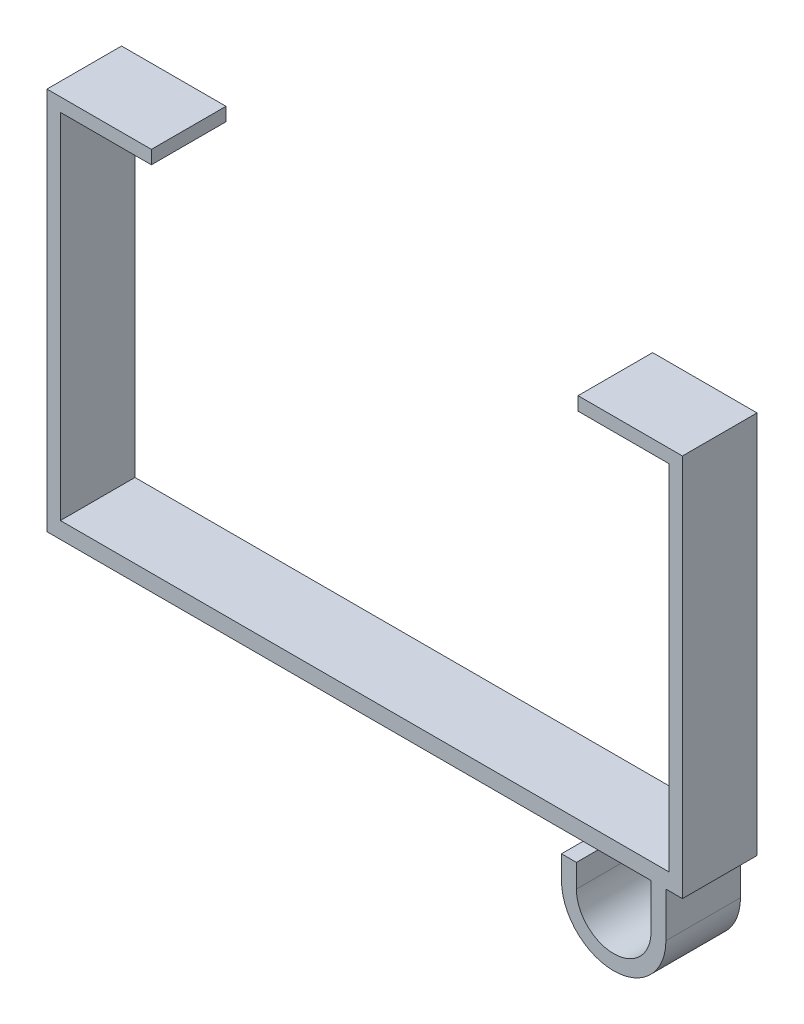
ISO-10303-21;
HEADER;
FILE_DESCRIPTION(('STEP AP214'),'2;1');
FILE_NAME('part.step','',(''),(''),'','','');
FILE_SCHEMA(('AUTOMOTIVE_DESIGN { 1 0 10303 214 1 1 1 1 }'));
ENDSEC;
DATA;
#1=APPLICATION_CONTEXT('core data for automotive mechanical design processes');
#2=APPLICATION_PROTOCOL_DEFINITION('international standard','automotive_design',2000,#1);
#3=PRODUCT_CONTEXT('',#1,'mechanical');
#4=PRODUCT('Part','Part','',(#3));
#5=PRODUCT_RELATED_PRODUCT_CATEGORY('part','',(#4));
#6=PRODUCT_DEFINITION_FORMATION('','',#4);
#7=PRODUCT_DEFINITION_CONTEXT('part definition',#1,'design');
#8=PRODUCT_DEFINITION('design','',#6,#7);
#9=PRODUCT_DEFINITION_SHAPE('','',#8);
#10=(LENGTH_UNIT() NAMED_UNIT(*) SI_UNIT(.MILLI.,.METRE.));
#11=(NAMED_UNIT(*) PLANE_ANGLE_UNIT() SI_UNIT($,.RADIAN.));
#12=(NAMED_UNIT(*) SI_UNIT($,.STERADIAN.) SOLID_ANGLE_UNIT());
#13=UNCERTAINTY_MEASURE_WITH_UNIT(LENGTH_MEASURE(1.E-05),#10,'distance_accuracy_value','');
#14=(GEOMETRIC_REPRESENTATION_CONTEXT(3) GLOBAL_UNCERTAINTY_ASSIGNED_CONTEXT((#13)) GLOBAL_UNIT_ASSIGNED_CONTEXT((#10,
#11,#12)) REPRESENTATION_CONTEXT('',''));
#15=CARTESIAN_POINT('',(0.,0.,0.));
#16=DIRECTION('',(0.,0.,1.));
#17=DIRECTION('',(1.,0.,0.));
#18=AXIS2_PLACEMENT_3D('',#15,#16,#17);
#19=CARTESIAN_POINT('',(0.,-12.85,5.));
#20=DIRECTION('',(0.,1.,0.));
#21=DIRECTION('',(0.,0.,1.));
#22=AXIS2_PLACEMENT_3D('',#19,#20,#21);
#23=PLANE('',#22);
#24=DIRECTION('',(0.,0.,-1.));
#25=VECTOR('',#24,1.);
#26=CARTESIAN_POINT('',(19.1906898394802,-12.85,5.));
#27=LINE('',#26,#25);
#28=CARTESIAN_POINT('',(19.1906898394802,-12.85,5.));
#29=VERTEX_POINT('',#28);
#30=CARTESIAN_POINT('',(19.1906898394802,-12.85,0.));
#31=VERTEX_POINT('',#30);
#32=EDGE_CURVE('E310',#29,#31,#27,.T.);
#33=ORIENTED_EDGE('',*,*,#32,.F.);
#34=DIRECTION('',(1.,0.,0.));
#35=VECTOR('',#34,1.);
#36=CARTESIAN_POINT('',(0.,-12.85,5.));
#37=LINE('',#36,#35);
#38=CARTESIAN_POINT('',(-21.3,-12.85,5.));
#39=VERTEX_POINT('',#38);
#40=EDGE_CURVE('E163',#39,#29,#37,.T.);
#41=ORIENTED_EDGE('',*,*,#40,.F.);
#42=DIRECTION('',(0.,0.,-1.));
#43=VECTOR('',#42,1.);
#44=CARTESIAN_POINT('',(-21.3,-12.85,5.));
#45=LINE('',#44,#43);
#46=CARTESIAN_POINT('',(-21.3,-12.85,0.));
#47=VERTEX_POINT('',#46);
#48=EDGE_CURVE('E175',#39,#47,#45,.T.);
#49=ORIENTED_EDGE('',*,*,#48,.T.);
#50=DIRECTION('',(1.,0.,0.));
#51=VECTOR('',#50,1.);
#52=CARTESIAN_POINT('',(0.,-12.85,0.));
#53=LINE('',#52,#51);
#54=EDGE_CURVE('E221',#47,#31,#53,.T.);
#55=ORIENTED_EDGE('',*,*,#54,.T.);
#56=EDGE_LOOP('',(#33,#41,#49,#55));
#57=FACE_BOUND('',#56,.T.);
#58=ADVANCED_FACE('F43',(#57),#23,.F.);
#59=CARTESIAN_POINT('',(14.3,0.,5.));
#60=DIRECTION('',(1.,0.,0.));
#61=DIRECTION('',(0.,0.,-1.));
#62=AXIS2_PLACEMENT_3D('',#59,#60,#61);
#63=PLANE('',#62);
#64=DIRECTION('',(0.,-1.,0.));
#65=VECTOR('',#64,1.);
#66=CARTESIAN_POINT('',(14.3,0.,0.));
#67=LINE('',#66,#65);
#68=CARTESIAN_POINT('',(14.3,12.85,0.));
#69=VERTEX_POINT('',#68);
#70=CARTESIAN_POINT('',(14.3,11.95,0.));
#71=VERTEX_POINT('',#70);
#72=EDGE_CURVE('E188',#69,#71,#67,.T.);
#73=ORIENTED_EDGE('',*,*,#72,.T.);
#74=DIRECTION('',(0.,0.,-1.));
#75=VECTOR('',#74,1.);
#76=CARTESIAN_POINT('',(14.3,11.95,5.));
#77=LINE('',#76,#75);
#78=CARTESIAN_POINT('',(14.3,11.95,5.));
#79=VERTEX_POINT('',#78);
#80=EDGE_CURVE('E11',#79,#71,#77,.T.);
#81=ORIENTED_EDGE('',*,*,#80,.F.);
#82=DIRECTION('',(0.,-1.,0.));
#83=VECTOR('',#82,1.);
#84=CARTESIAN_POINT('',(14.3,0.,5.));
#85=LINE('',#84,#83);
#86=CARTESIAN_POINT('',(14.3,12.85,5.));
#87=VERTEX_POINT('',#86);
#88=EDGE_CURVE('E232',#87,#79,#85,.T.);
#89=ORIENTED_EDGE('',*,*,#88,.F.);
#90=DIRECTION('',(0.,0.,-1.));
#91=VECTOR('',#90,1.);
#92=CARTESIAN_POINT('',(14.3,12.85,5.));
#93=LINE('',#92,#91);
#94=EDGE_CURVE('E68',#87,#69,#93,.T.);
#95=ORIENTED_EDGE('',*,*,#94,.T.);
#96=EDGE_LOOP('',(#73,#81,#89,#95));
#97=FACE_BOUND('',#96,.T.);
#98=ADVANCED_FACE('F45',(#97),#63,.F.);
#99=CARTESIAN_POINT('',(0.,11.95,5.));
#100=DIRECTION('',(0.,1.,0.));
#101=DIRECTION('',(-1.,0.,0.));
#102=AXIS2_PLACEMENT_3D('',#99,#100,#101);
#103=PLANE('',#102);
#104=DIRECTION('',(1.,0.,0.));
#105=VECTOR('',#104,1.);
#106=CARTESIAN_POINT('',(0.,11.95,0.));
#107=LINE('',#106,#105);
#108=CARTESIAN_POINT('',(20.4,11.95,0.));
#109=VERTEX_POINT('',#108);
#110=EDGE_CURVE('E191',#71,#109,#107,.T.);
#111=ORIENTED_EDGE('',*,*,#110,.T.);
#112=DIRECTION('',(0.,0.,-1.));
#113=VECTOR('',#112,1.);
#114=CARTESIAN_POINT('',(20.4,11.95,5.));
#115=LINE('',#114,#113);
#116=CARTESIAN_POINT('',(20.4,11.95,5.));
#117=VERTEX_POINT('',#116);
#118=EDGE_CURVE('E52',#117,#109,#115,.T.);
#119=ORIENTED_EDGE('',*,*,#118,.F.);
#120=DIRECTION('',(1.,0.,0.));
#121=VECTOR('',#120,1.);
#122=CARTESIAN_POINT('',(0.,11.95,5.));
#123=LINE('',#122,#121);
#124=EDGE_CURVE('E119',#79,#117,#123,.T.);
#125=ORIENTED_EDGE('',*,*,#124,.F.);
#126=ORIENTED_EDGE('',*,*,#80,.T.);
#127=EDGE_LOOP('',(#111,#119,#125,#126));
#128=FACE_BOUND('',#127,.T.);
#129=ADVANCED_FACE('F335',(#128),#103,.F.);
#130=CARTESIAN_POINT('',(20.4,0.,5.));
#131=DIRECTION('',(1.,0.,0.));
#132=DIRECTION('',(0.,1.,0.));
#133=AXIS2_PLACEMENT_3D('',#130,#131,#132);
#134=PLANE('',#133);
#135=DIRECTION('',(0.,-1.,0.));
#136=VECTOR('',#135,1.);
#137=CARTESIAN_POINT('',(20.4,0.,0.));
#138=LINE('',#137,#136);
#139=CARTESIAN_POINT('',(20.4,-11.75,0.));
#140=VERTEX_POINT('',#139);
#141=EDGE_CURVE('E195',#109,#140,#138,.T.);
#142=ORIENTED_EDGE('',*,*,#141,.T.);
#143=DIRECTION('',(0.,0.,-1.));
#144=VECTOR('',#143,1.);
#145=CARTESIAN_POINT('',(20.4,-11.75,5.));
#146=LINE('',#145,#144);
#147=CARTESIAN_POINT('',(20.4,-11.75,5.));
#148=VERTEX_POINT('',#147);
#149=EDGE_CURVE('E256',#148,#140,#146,.T.);
#150=ORIENTED_EDGE('',*,*,#149,.F.);
#151=DIRECTION('',(0.,-1.,0.));
#152=VECTOR('',#151,1.);
#153=CARTESIAN_POINT('',(20.4,0.,5.));
#154=LINE('',#153,#152);
#155=EDGE_CURVE('E265',#117,#148,#154,.T.);
#156=ORIENTED_EDGE('',*,*,#155,.F.);
#157=ORIENTED_EDGE('',*,*,#118,.T.);
#158=EDGE_LOOP('',(#142,#150,#156,#157));
#159=FACE_BOUND('',#158,.T.);
#160=ADVANCED_FACE('F263',(#159),#134,.F.);
#161=CARTESIAN_POINT('',(0.,-11.75,5.));
#162=DIRECTION('',(0.,1.,0.));
#163=DIRECTION('',(-1.,0.,0.));
#164=AXIS2_PLACEMENT_3D('',#161,#162,#163);
#165=PLANE('',#164);
#166=DIRECTION('',(1.,0.,0.));
#167=VECTOR('',#166,1.);
#168=CARTESIAN_POINT('',(0.,-11.75,0.));
#169=LINE('',#168,#167);
#170=CARTESIAN_POINT('',(-20.4,-11.75,0.));
#171=VERTEX_POINT('',#170);
#172=EDGE_CURVE('E199',#171,#140,#169,.T.);
#173=ORIENTED_EDGE('',*,*,#172,.F.);
#174=DIRECTION('',(0.,0.,-1.));
#175=VECTOR('',#174,1.);
#176=CARTESIAN_POINT('',(-20.4,-11.75,5.));
#177=LINE('',#176,#175);
#178=CARTESIAN_POINT('',(-20.4,-11.75,5.));
#179=VERTEX_POINT('',#178);
#180=EDGE_CURVE('E253',#179,#171,#177,.T.);
#181=ORIENTED_EDGE('',*,*,#180,.F.);
#182=DIRECTION('',(1.,0.,0.));
#183=VECTOR('',#182,1.);
#184=CARTESIAN_POINT('',(0.,-11.75,5.));
#185=LINE('',#184,#183);
#186=EDGE_CURVE('E275',#179,#148,#185,.T.);
#187=ORIENTED_EDGE('',*,*,#186,.T.);
#188=ORIENTED_EDGE('',*,*,#149,.T.);
#189=EDGE_LOOP('',(#173,#181,#187,#188));
#190=FACE_BOUND('',#189,.T.);
#191=ADVANCED_FACE('F272',(#190),#165,.T.);
#192=CARTESIAN_POINT('',(-20.4,0.,5.));
#193=DIRECTION('',(1.,0.,0.));
#194=DIRECTION('',(0.,1.,0.));
#195=AXIS2_PLACEMENT_3D('',#192,#193,#194);
#196=PLANE('',#195);
#197=DIRECTION('',(0.,-1.,0.));
#198=VECTOR('',#197,1.);
#199=CARTESIAN_POINT('',(-20.4,0.,0.));
#200=LINE('',#199,#198);
#201=CARTESIAN_POINT('',(-20.4,11.95,0.));
#202=VERTEX_POINT('',#201);
#203=EDGE_CURVE('E203',#202,#171,#200,.T.);
#204=ORIENTED_EDGE('',*,*,#203,.F.);
#205=DIRECTION('',(0.,0.,-1.));
#206=VECTOR('',#205,1.);
#207=CARTESIAN_POINT('',(-20.4,11.95,5.));
#208=LINE('',#207,#206);
#209=CARTESIAN_POINT('',(-20.4,11.95,5.));
#210=VERTEX_POINT('',#209);
#211=EDGE_CURVE('E250',#210,#202,#208,.T.);
#212=ORIENTED_EDGE('',*,*,#211,.F.);
#213=DIRECTION('',(0.,-1.,0.));
#214=VECTOR('',#213,1.);
#215=CARTESIAN_POINT('',(-20.4,0.,5.));
#216=LINE('',#215,#214);
#217=EDGE_CURVE('E279',#210,#179,#216,.T.);
#218=ORIENTED_EDGE('',*,*,#217,.T.);
#219=ORIENTED_EDGE('',*,*,#180,.T.);
#220=EDGE_LOOP('',(#204,#212,#218,#219));
#221=FACE_BOUND('',#220,.T.);
#222=ADVANCED_FACE('F368',(#221),#196,.T.);
#223=CARTESIAN_POINT('',(0.,11.95,5.));
#224=DIRECTION('',(0.,1.,0.));
#225=DIRECTION('',(0.,0.,1.));
#226=AXIS2_PLACEMENT_3D('',#223,#224,#225);
#227=PLANE('',#226);
#228=DIRECTION('',(1.,0.,0.));
#229=VECTOR('',#228,1.);
#230=CARTESIAN_POINT('',(0.,11.95,0.));
#231=LINE('',#230,#229);
#232=CARTESIAN_POINT('',(-14.3,11.95,0.));
#233=VERTEX_POINT('',#232);
#234=EDGE_CURVE('E207',#202,#233,#231,.T.);
#235=ORIENTED_EDGE('',*,*,#234,.T.);
#236=DIRECTION('',(0.,0.,-1.));
#237=VECTOR('',#236,1.);
#238=CARTESIAN_POINT('',(-14.3,11.95,5.));
#239=LINE('',#238,#237);
#240=CARTESIAN_POINT('',(-14.3,11.95,5.));
#241=VERTEX_POINT('',#240);
#242=EDGE_CURVE('E246',#241,#233,#239,.T.);
#243=ORIENTED_EDGE('',*,*,#242,.F.);
#244=DIRECTION('',(1.,0.,0.));
#245=VECTOR('',#244,1.);
#246=CARTESIAN_POINT('',(0.,11.95,5.));
#247=LINE('',#246,#245);
#248=EDGE_CURVE('E283',#210,#241,#247,.T.);
#249=ORIENTED_EDGE('',*,*,#248,.F.);
#250=ORIENTED_EDGE('',*,*,#211,.T.);
#251=EDGE_LOOP('',(#235,#243,#249,#250));
#252=FACE_BOUND('',#251,.T.);
#253=ADVANCED_FACE('F364',(#252),#227,.F.);
#254=CARTESIAN_POINT('',(-14.3,0.,5.));
#255=DIRECTION('',(-1.,0.,0.));
#256=DIRECTION('',(0.,0.,1.));
#257=AXIS2_PLACEMENT_3D('',#254,#255,#256);
#258=PLANE('',#257);
#259=DIRECTION('',(0.,1.,0.));
#260=VECTOR('',#259,1.);
#261=CARTESIAN_POINT('',(-14.3,0.,0.));
#262=LINE('',#261,#260);
#263=CARTESIAN_POINT('',(-14.3,12.85,0.));
#264=VERTEX_POINT('',#263);
#265=EDGE_CURVE('E210',#233,#264,#262,.T.);
#266=ORIENTED_EDGE('',*,*,#265,.T.);
#267=DIRECTION('',(0.,0.,-1.));
#268=VECTOR('',#267,1.);
#269=CARTESIAN_POINT('',(-14.3,12.85,5.));
#270=LINE('',#269,#268);
#271=CARTESIAN_POINT('',(-14.3,12.85,5.));
#272=VERTEX_POINT('',#271);
#273=EDGE_CURVE('E243',#272,#264,#270,.T.);
#274=ORIENTED_EDGE('',*,*,#273,.F.);
#275=DIRECTION('',(0.,1.,0.));
#276=VECTOR('',#275,1.);
#277=CARTESIAN_POINT('',(-14.3,0.,5.));
#278=LINE('',#277,#276);
#279=EDGE_CURVE('E290',#241,#272,#278,.T.);
#280=ORIENTED_EDGE('',*,*,#279,.F.);
#281=ORIENTED_EDGE('',*,*,#242,.T.);
#282=EDGE_LOOP('',(#266,#274,#280,#281));
#283=FACE_BOUND('',#282,.T.);
#284=ADVANCED_FACE('F358',(#283),#258,.F.);
#285=CARTESIAN_POINT('',(0.,12.85,5.));
#286=DIRECTION('',(0.,1.,0.));
#287=DIRECTION('',(0.,0.,1.));
#288=AXIS2_PLACEMENT_3D('',#285,#286,#287);
#289=PLANE('',#288);
#290=DIRECTION('',(1.,0.,0.));
#291=VECTOR('',#290,1.);
#292=CARTESIAN_POINT('',(0.,12.85,0.));
#293=LINE('',#292,#291);
#294=CARTESIAN_POINT('',(-21.3,12.85,0.));
#295=VERTEX_POINT('',#294);
#296=EDGE_CURVE('E214',#295,#264,#293,.T.);
#297=ORIENTED_EDGE('',*,*,#296,.F.);
#298=DIRECTION('',(0.,0.,-1.));
#299=VECTOR('',#298,1.);
#300=CARTESIAN_POINT('',(-21.3,12.85,5.));
#301=LINE('',#300,#299);
#302=CARTESIAN_POINT('',(-21.3,12.85,5.));
#303=VERTEX_POINT('',#302);
#304=EDGE_CURVE('E240',#303,#295,#301,.T.);
#305=ORIENTED_EDGE('',*,*,#304,.F.);
#306=DIRECTION('',(1.,0.,0.));
#307=VECTOR('',#306,1.);
#308=CARTESIAN_POINT('',(0.,12.85,5.));
#309=LINE('',#308,#307);
#310=EDGE_CURVE('E293',#303,#272,#309,.T.);
#311=ORIENTED_EDGE('',*,*,#310,.T.);
#312=ORIENTED_EDGE('',*,*,#273,.T.);
#313=EDGE_LOOP('',(#297,#305,#311,#312));
#314=FACE_BOUND('',#313,.T.);
#315=ADVANCED_FACE('F354',(#314),#289,.T.);
#316=CARTESIAN_POINT('',(-21.3,0.,5.));
#317=DIRECTION('',(1.,0.,0.));
#318=DIRECTION('',(0.,0.,-1.));
#319=AXIS2_PLACEMENT_3D('',#316,#317,#318);
#320=PLANE('',#319);
#321=DIRECTION('',(0.,-1.,0.));
#322=VECTOR('',#321,1.);
#323=CARTESIAN_POINT('',(-21.3,0.,0.));
#324=LINE('',#323,#322);
#325=EDGE_CURVE('E218',#295,#47,#324,.T.);
#326=ORIENTED_EDGE('',*,*,#325,.T.);
#327=ORIENTED_EDGE('',*,*,#48,.F.);
#328=DIRECTION('',(0.,-1.,0.));
#329=VECTOR('',#328,1.);
#330=CARTESIAN_POINT('',(-21.3,0.,5.));
#331=LINE('',#330,#329);
#332=EDGE_CURVE('E164',#303,#39,#331,.T.);
#333=ORIENTED_EDGE('',*,*,#332,.F.);
#334=ORIENTED_EDGE('',*,*,#304,.T.);
#335=EDGE_LOOP('',(#326,#327,#333,#334));
#336=FACE_BOUND('',#335,.T.);
#337=ADVANCED_FACE('F304',(#336),#320,.F.);
#338=CARTESIAN_POINT('',(20.1906898394802,-12.85,5.));
#339=VERTEX_POINT('',#338);
#340=CARTESIAN_POINT('',(21.3,-12.85,5.));
#341=VERTEX_POINT('',#340);
#342=EDGE_CURVE('E151',#339,#341,#37,.T.);
#343=ORIENTED_EDGE('',*,*,#342,.F.);
#344=DIRECTION('',(0.,0.,-1.));
#345=VECTOR('',#344,1.);
#346=CARTESIAN_POINT('',(20.1906898394802,-12.85,5.));
#347=LINE('',#346,#345);
#348=CARTESIAN_POINT('',(20.1906898394802,-12.85,0.));
#349=VERTEX_POINT('',#348);
#350=EDGE_CURVE('E319',#339,#349,#347,.T.);
#351=ORIENTED_EDGE('',*,*,#350,.T.);
#352=CARTESIAN_POINT('',(21.3,-12.85,0.));
#353=VERTEX_POINT('',#352);
#354=EDGE_CURVE('E170',#349,#353,#53,.T.);
#355=ORIENTED_EDGE('',*,*,#354,.T.);
#356=DIRECTION('',(0.,0.,-1.));
#357=VECTOR('',#356,1.);
#358=CARTESIAN_POINT('',(21.3,-12.85,5.));
#359=LINE('',#358,#357);
#360=EDGE_CURVE('E167',#341,#353,#359,.T.);
#361=ORIENTED_EDGE('',*,*,#360,.F.);
#362=EDGE_LOOP('',(#343,#351,#355,#361));
#363=FACE_BOUND('',#362,.T.);
#364=ADVANCED_FACE('F168',(#363),#23,.F.);
#365=CARTESIAN_POINT('',(21.3,0.,5.));
#366=DIRECTION('',(1.,0.,0.));
#367=DIRECTION('',(0.,0.,-1.));
#368=AXIS2_PLACEMENT_3D('',#365,#366,#367);
#369=PLANE('',#368);
#370=DIRECTION('',(0.,-1.,0.));
#371=VECTOR('',#370,1.);
#372=CARTESIAN_POINT('',(21.3,0.,0.));
#373=LINE('',#372,#371);
#374=CARTESIAN_POINT('',(21.3,12.85,0.));
#375=VERTEX_POINT('',#374);
#376=EDGE_CURVE('E225',#375,#353,#373,.T.);
#377=ORIENTED_EDGE('',*,*,#376,.F.);
#378=DIRECTION('',(0.,0.,-1.));
#379=VECTOR('',#378,1.);
#380=CARTESIAN_POINT('',(21.3,12.85,5.));
#381=LINE('',#380,#379);
#382=CARTESIAN_POINT('',(21.3,12.85,5.));
#383=VERTEX_POINT('',#382);
#384=EDGE_CURVE('E176',#383,#375,#381,.T.);
#385=ORIENTED_EDGE('',*,*,#384,.F.);
#386=DIRECTION('',(0.,-1.,0.));
#387=VECTOR('',#386,1.);
#388=CARTESIAN_POINT('',(21.3,0.,5.));
#389=LINE('',#388,#387);
#390=EDGE_CURVE('E156',#383,#341,#389,.T.);
#391=ORIENTED_EDGE('',*,*,#390,.T.);
#392=ORIENTED_EDGE('',*,*,#360,.T.);
#393=EDGE_LOOP('',(#377,#385,#391,#392));
#394=FACE_BOUND('',#393,.T.);
#395=ADVANCED_FACE('F178',(#394),#369,.T.);
#396=CARTESIAN_POINT('',(0.,12.85,5.));
#397=DIRECTION('',(0.,1.,0.));
#398=DIRECTION('',(0.,0.,1.));
#399=AXIS2_PLACEMENT_3D('',#396,#397,#398);
#400=PLANE('',#399);
#401=DIRECTION('',(1.,0.,0.));
#402=VECTOR('',#401,1.);
#403=CARTESIAN_POINT('',(0.,12.85,0.));
#404=LINE('',#403,#402);
#405=EDGE_CURVE('E228',#69,#375,#404,.T.);
#406=ORIENTED_EDGE('',*,*,#405,.F.);
#407=ORIENTED_EDGE('',*,*,#94,.F.);
#408=DIRECTION('',(1.,0.,0.));
#409=VECTOR('',#408,1.);
#410=CARTESIAN_POINT('',(0.,12.85,5.));
#411=LINE('',#410,#409);
#412=EDGE_CURVE('E180',#87,#383,#411,.T.);
#413=ORIENTED_EDGE('',*,*,#412,.T.);
#414=ORIENTED_EDGE('',*,*,#384,.T.);
#415=EDGE_LOOP('',(#406,#407,#413,#414));
#416=FACE_BOUND('',#415,.T.);
#417=ADVANCED_FACE('F353',(#416),#400,.T.);
#418=CARTESIAN_POINT('',(0.,0.,5.));
#419=DIRECTION('',(0.,0.,1.));
#420=DIRECTION('',(1.,0.,0.));
#421=AXIS2_PLACEMENT_3D('',#418,#419,#420);
#422=PLANE('',#421);
#423=ORIENTED_EDGE('',*,*,#88,.T.);
#424=ORIENTED_EDGE('',*,*,#124,.T.);
#425=ORIENTED_EDGE('',*,*,#155,.T.);
#426=ORIENTED_EDGE('',*,*,#186,.F.);
#427=ORIENTED_EDGE('',*,*,#217,.F.);
#428=ORIENTED_EDGE('',*,*,#248,.T.);
#429=ORIENTED_EDGE('',*,*,#279,.T.);
#430=ORIENTED_EDGE('',*,*,#310,.F.);
#431=ORIENTED_EDGE('',*,*,#332,.T.);
#432=ORIENTED_EDGE('',*,*,#40,.T.);
#433=DIRECTION('',(0.,1.,0.));
#434=VECTOR('',#433,1.);
#435=CARTESIAN_POINT('',(19.1906898394802,0.,5.));
#436=LINE('',#435,#434);
#437=CARTESIAN_POINT('',(19.1906898394802,-15.85,5.));
#438=VERTEX_POINT('',#437);
#439=EDGE_CURVE('E601',#438,#29,#436,.T.);
#440=ORIENTED_EDGE('',*,*,#439,.F.);
#441=CARTESIAN_POINT('',(16.6906898394802,-15.85,5.));
#442=DIRECTION('',(0.,0.,1.));
#443=DIRECTION('',(1.,0.,0.));
#444=AXIS2_PLACEMENT_3D('',#441,#442,#443);
#445=CIRCLE('',#444,2.5);
#446=CARTESIAN_POINT('',(14.1906898394802,-15.85,5.));
#447=VERTEX_POINT('',#446);
#448=EDGE_CURVE('E604',#438,#447,#445,.F.);
#449=ORIENTED_EDGE('',*,*,#448,.T.);
#450=DIRECTION('',(0.,1.,0.));
#451=VECTOR('',#450,1.);
#452=CARTESIAN_POINT('',(14.1906898394802,0.,5.));
#453=LINE('',#452,#451);
#454=CARTESIAN_POINT('',(14.1906898394802,-14.2995417940046,5.));
#455=VERTEX_POINT('',#454);
#456=EDGE_CURVE('E575',#447,#455,#453,.T.);
#457=ORIENTED_EDGE('',*,*,#456,.T.);
#458=DIRECTION('',(1.,0.,0.));
#459=VECTOR('',#458,1.);
#460=CARTESIAN_POINT('',(0.,-14.2995417940046,5.));
#461=LINE('',#460,#459);
#462=CARTESIAN_POINT('',(13.1906898394802,-14.2995417940046,5.));
#463=VERTEX_POINT('',#462);
#464=EDGE_CURVE('E610',#463,#455,#461,.T.);
#465=ORIENTED_EDGE('',*,*,#464,.F.);
#466=DIRECTION('',(0.,-1.,0.));
#467=VECTOR('',#466,1.);
#468=CARTESIAN_POINT('',(13.1906898394802,0.,5.));
#469=LINE('',#468,#467);
#470=CARTESIAN_POINT('',(13.1906898394802,-15.85,5.));
#471=VERTEX_POINT('',#470);
#472=EDGE_CURVE('E538',#463,#471,#469,.T.);
#473=ORIENTED_EDGE('',*,*,#472,.T.);
#474=CARTESIAN_POINT('',(16.6906898394802,-15.85,5.));
#475=DIRECTION('',(0.,0.,1.));
#476=DIRECTION('',(1.,0.,0.));
#477=AXIS2_PLACEMENT_3D('',#474,#475,#476);
#478=CIRCLE('',#477,3.5);
#479=CARTESIAN_POINT('',(20.1906898394802,-15.85,5.));
#480=VERTEX_POINT('',#479);
#481=EDGE_CURVE('E530',#471,#480,#478,.T.);
#482=ORIENTED_EDGE('',*,*,#481,.T.);
#483=DIRECTION('',(0.,-1.,0.));
#484=VECTOR('',#483,1.);
#485=CARTESIAN_POINT('',(20.1906898394802,0.,5.));
#486=LINE('',#485,#484);
#487=EDGE_CURVE('E160',#339,#480,#486,.T.);
#488=ORIENTED_EDGE('',*,*,#487,.F.);
#489=ORIENTED_EDGE('',*,*,#342,.T.);
#490=ORIENTED_EDGE('',*,*,#390,.F.);
#491=ORIENTED_EDGE('',*,*,#412,.F.);
#492=EDGE_LOOP('',(#423,#424,#425,#426,#427,#428,#429,#430,#431,#432,#440,#449,#457,#465,#473,
#482,#488,#489,#490,#491));
#493=FACE_BOUND('',#492,.T.);
#494=ADVANCED_FACE('F153',(#493),#422,.T.);
#495=CARTESIAN_POINT('',(0.,0.,0.));
#496=DIRECTION('',(0.,0.,1.));
#497=DIRECTION('',(1.,0.,0.));
#498=AXIS2_PLACEMENT_3D('',#495,#496,#497);
#499=PLANE('',#498);
#500=ORIENTED_EDGE('',*,*,#72,.F.);
#501=ORIENTED_EDGE('',*,*,#405,.T.);
#502=ORIENTED_EDGE('',*,*,#376,.T.);
#503=ORIENTED_EDGE('',*,*,#354,.F.);
#504=DIRECTION('',(0.,-1.,0.));
#505=VECTOR('',#504,1.);
#506=CARTESIAN_POINT('',(20.1906898394802,0.,0.));
#507=LINE('',#506,#505);
#508=CARTESIAN_POINT('',(20.1906898394802,-15.85,0.));
#509=VERTEX_POINT('',#508);
#510=EDGE_CURVE('E59',#349,#509,#507,.T.);
#511=ORIENTED_EDGE('',*,*,#510,.T.);
#512=CARTESIAN_POINT('',(16.6906898394802,-15.85,0.));
#513=DIRECTION('',(0.,0.,1.));
#514=DIRECTION('',(1.,0.,0.));
#515=AXIS2_PLACEMENT_3D('',#512,#513,#514);
#516=CIRCLE('',#515,3.5);
#517=CARTESIAN_POINT('',(13.1906898394802,-15.85,0.));
#518=VERTEX_POINT('',#517);
#519=EDGE_CURVE('E536',#518,#509,#516,.T.);
#520=ORIENTED_EDGE('',*,*,#519,.F.);
#521=DIRECTION('',(0.,-1.,0.));
#522=VECTOR('',#521,1.);
#523=CARTESIAN_POINT('',(13.1906898394802,0.,0.));
#524=LINE('',#523,#522);
#525=CARTESIAN_POINT('',(13.1906898394802,-14.2995417940046,0.));
#526=VERTEX_POINT('',#525);
#527=EDGE_CURVE('E517',#526,#518,#524,.T.);
#528=ORIENTED_EDGE('',*,*,#527,.F.);
#529=DIRECTION('',(1.,0.,0.));
#530=VECTOR('',#529,1.);
#531=CARTESIAN_POINT('',(0.,-14.2995417940046,0.));
#532=LINE('',#531,#530);
#533=CARTESIAN_POINT('',(14.1906898394802,-14.2995417940046,0.));
#534=VERTEX_POINT('',#533);
#535=EDGE_CURVE('E531',#526,#534,#532,.T.);
#536=ORIENTED_EDGE('',*,*,#535,.T.);
#537=DIRECTION('',(0.,1.,0.));
#538=VECTOR('',#537,1.);
#539=CARTESIAN_POINT('',(14.1906898394802,0.,0.));
#540=LINE('',#539,#538);
#541=CARTESIAN_POINT('',(14.1906898394802,-15.85,0.));
#542=VERTEX_POINT('',#541);
#543=EDGE_CURVE('E554',#542,#534,#540,.T.);
#544=ORIENTED_EDGE('',*,*,#543,.F.);
#545=CARTESIAN_POINT('',(16.6906898394802,-15.85,0.));
#546=DIRECTION('',(0.,0.,1.));
#547=DIRECTION('',(1.,0.,0.));
#548=AXIS2_PLACEMENT_3D('',#545,#546,#547);
#549=CIRCLE('',#548,2.5);
#550=CARTESIAN_POINT('',(19.1906898394802,-15.85,0.));
#551=VERTEX_POINT('',#550);
#552=EDGE_CURVE('E550',#551,#542,#549,.F.);
#553=ORIENTED_EDGE('',*,*,#552,.F.);
#554=DIRECTION('',(0.,1.,0.));
#555=VECTOR('',#554,1.);
#556=CARTESIAN_POINT('',(19.1906898394802,0.,0.));
#557=LINE('',#556,#555);
#558=EDGE_CURVE('E543',#551,#31,#557,.T.);
#559=ORIENTED_EDGE('',*,*,#558,.T.);
#560=ORIENTED_EDGE('',*,*,#54,.F.);
#561=ORIENTED_EDGE('',*,*,#325,.F.);
#562=ORIENTED_EDGE('',*,*,#296,.T.);
#563=ORIENTED_EDGE('',*,*,#265,.F.);
#564=ORIENTED_EDGE('',*,*,#234,.F.);
#565=ORIENTED_EDGE('',*,*,#203,.T.);
#566=ORIENTED_EDGE('',*,*,#172,.T.);
#567=ORIENTED_EDGE('',*,*,#141,.F.);
#568=ORIENTED_EDGE('',*,*,#110,.F.);
#569=EDGE_LOOP('',(#500,#501,#502,#503,#511,#520,#528,#536,#544,#553,#559,#560,#561,#562,#563,
#564,#565,#566,#567,#568));
#570=FACE_BOUND('',#569,.T.);
#571=ADVANCED_FACE('F267',(#570),#499,.F.);
#572=CARTESIAN_POINT('',(16.6906898394802,-15.85,5.));
#573=DIRECTION('',(0.,0.,-1.));
#574=DIRECTION('',(-1.,0.,0.));
#575=AXIS2_PLACEMENT_3D('',#572,#573,#574);
#576=CYLINDRICAL_SURFACE('',#575,3.5);
#577=ORIENTED_EDGE('',*,*,#519,.T.);
#578=DIRECTION('',(0.,0.,-1.));
#579=VECTOR('',#578,1.);
#580=CARTESIAN_POINT('',(20.1906898394802,-15.85,5.));
#581=LINE('',#580,#579);
#582=EDGE_CURVE('E192',#480,#509,#581,.T.);
#583=ORIENTED_EDGE('',*,*,#582,.F.);
#584=ORIENTED_EDGE('',*,*,#481,.F.);
#585=DIRECTION('',(0.,0.,-1.));
#586=VECTOR('',#585,1.);
#587=CARTESIAN_POINT('',(13.1906898394802,-15.85,5.));
#588=LINE('',#587,#586);
#589=EDGE_CURVE('E520',#471,#518,#588,.T.);
#590=ORIENTED_EDGE('',*,*,#589,.T.);
#591=EDGE_LOOP('',(#577,#583,#584,#590));
#592=FACE_BOUND('',#591,.T.);
#593=ADVANCED_FACE('F442',(#592),#576,.T.);
#594=CARTESIAN_POINT('',(20.1906898394802,0.,5.));
#595=DIRECTION('',(1.,0.,0.));
#596=DIRECTION('',(0.,1.,0.));
#597=AXIS2_PLACEMENT_3D('',#594,#595,#596);
#598=PLANE('',#597);
#599=ORIENTED_EDGE('',*,*,#510,.F.);
#600=ORIENTED_EDGE('',*,*,#350,.F.);
#601=ORIENTED_EDGE('',*,*,#487,.T.);
#602=ORIENTED_EDGE('',*,*,#582,.T.);
#603=EDGE_LOOP('',(#599,#600,#601,#602));
#604=FACE_BOUND('',#603,.T.);
#605=ADVANCED_FACE('F451',(#604),#598,.T.);
#606=CARTESIAN_POINT('',(19.1906898394802,0.,5.));
#607=DIRECTION('',(-1.,0.,0.));
#608=DIRECTION('',(0.,0.,1.));
#609=AXIS2_PLACEMENT_3D('',#606,#607,#608);
#610=PLANE('',#609);
#611=ORIENTED_EDGE('',*,*,#558,.F.);
#612=DIRECTION('',(0.,0.,-1.));
#613=VECTOR('',#612,1.);
#614=CARTESIAN_POINT('',(19.1906898394802,-15.85,5.));
#615=LINE('',#614,#613);
#616=EDGE_CURVE('E320',#438,#551,#615,.T.);
#617=ORIENTED_EDGE('',*,*,#616,.F.);
#618=ORIENTED_EDGE('',*,*,#439,.T.);
#619=ORIENTED_EDGE('',*,*,#32,.T.);
#620=EDGE_LOOP('',(#611,#617,#618,#619));
#621=FACE_BOUND('',#620,.T.);
#622=ADVANCED_FACE('F461',(#621),#610,.T.);
#623=CARTESIAN_POINT('',(16.6906898394802,-15.85,5.));
#624=DIRECTION('',(0.,0.,-1.));
#625=DIRECTION('',(-1.,0.,0.));
#626=AXIS2_PLACEMENT_3D('',#623,#624,#625);
#627=CYLINDRICAL_SURFACE('',#626,2.5);
#628=ORIENTED_EDGE('',*,*,#552,.T.);
#629=DIRECTION('',(0.,0.,-1.));
#630=VECTOR('',#629,1.);
#631=CARTESIAN_POINT('',(14.1906898394802,-15.85,5.));
#632=LINE('',#631,#630);
#633=EDGE_CURVE('E326',#447,#542,#632,.T.);
#634=ORIENTED_EDGE('',*,*,#633,.F.);
#635=ORIENTED_EDGE('',*,*,#448,.F.);
#636=ORIENTED_EDGE('',*,*,#616,.T.);
#637=EDGE_LOOP('',(#628,#634,#635,#636));
#638=FACE_BOUND('',#637,.T.);
#639=ADVANCED_FACE('F470',(#638),#627,.F.);
#640=CARTESIAN_POINT('',(14.1906898394802,0.,5.));
#641=DIRECTION('',(-1.,0.,0.));
#642=DIRECTION('',(0.,0.,1.));
#643=AXIS2_PLACEMENT_3D('',#640,#641,#642);
#644=PLANE('',#643);
#645=ORIENTED_EDGE('',*,*,#543,.T.);
#646=DIRECTION('',(0.,0.,-1.));
#647=VECTOR('',#646,1.);
#648=CARTESIAN_POINT('',(14.1906898394802,-14.2995417940046,5.));
#649=LINE('',#648,#647);
#650=EDGE_CURVE('E562',#455,#534,#649,.T.);
#651=ORIENTED_EDGE('',*,*,#650,.F.);
#652=ORIENTED_EDGE('',*,*,#456,.F.);
#653=ORIENTED_EDGE('',*,*,#633,.T.);
#654=EDGE_LOOP('',(#645,#651,#652,#653));
#655=FACE_BOUND('',#654,.T.);
#656=ADVANCED_FACE('F479',(#655),#644,.F.);
#657=CARTESIAN_POINT('',(0.,-14.2995417940046,5.));
#658=DIRECTION('',(0.,1.,0.));
#659=DIRECTION('',(0.,0.,1.));
#660=AXIS2_PLACEMENT_3D('',#657,#658,#659);
#661=PLANE('',#660);
#662=ORIENTED_EDGE('',*,*,#535,.F.);
#663=DIRECTION('',(0.,0.,-1.));
#664=VECTOR('',#663,1.);
#665=CARTESIAN_POINT('',(13.1906898394802,-14.2995417940046,5.));
#666=LINE('',#665,#664);
#667=EDGE_CURVE('E524',#463,#526,#666,.T.);
#668=ORIENTED_EDGE('',*,*,#667,.F.);
#669=ORIENTED_EDGE('',*,*,#464,.T.);
#670=ORIENTED_EDGE('',*,*,#650,.T.);
#671=EDGE_LOOP('',(#662,#668,#669,#670));
#672=FACE_BOUND('',#671,.T.);
#673=ADVANCED_FACE('F489',(#672),#661,.T.);
#674=CARTESIAN_POINT('',(13.1906898394802,0.,5.));
#675=DIRECTION('',(1.,0.,0.));
#676=DIRECTION('',(0.,0.,-1.));
#677=AXIS2_PLACEMENT_3D('',#674,#675,#676);
#678=PLANE('',#677);
#679=ORIENTED_EDGE('',*,*,#527,.T.);
#680=ORIENTED_EDGE('',*,*,#589,.F.);
#681=ORIENTED_EDGE('',*,*,#472,.F.);
#682=ORIENTED_EDGE('',*,*,#667,.T.);
#683=EDGE_LOOP('',(#679,#680,#681,#682));
#684=FACE_BOUND('',#683,.T.);
#685=ADVANCED_FACE('F499',(#684),#678,.F.);
#686=CLOSED_SHELL('',(#58,#98,#129,#160,#191,#222,#253,#284,#315,#337,#364,#395,#417,#494,#571,
#593,#605,#622,#639,#656,#673,#685));
#687=MANIFOLD_SOLID_BREP('B2',#686);
#688=ADVANCED_BREP_SHAPE_REPRESENTATION('',(#18,#687),#14);
#689=SHAPE_DEFINITION_REPRESENTATION(#9,#688);
ENDSEC;
END-ISO-10303-21;
